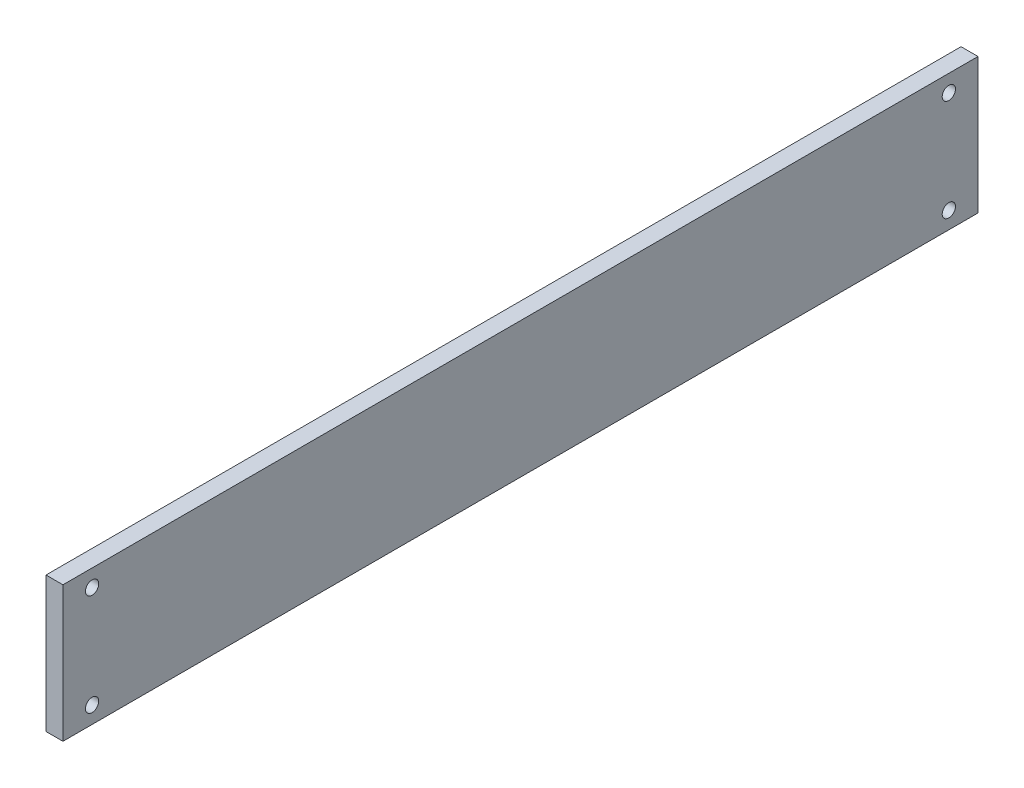
ISO-10303-21;
HEADER;
FILE_DESCRIPTION(('STEP AP214'),'2;1');
FILE_NAME('part.step','',(''),(''),'','','');
FILE_SCHEMA(('AUTOMOTIVE_DESIGN { 1 0 10303 214 1 1 1 1 }'));
ENDSEC;
DATA;
#1=APPLICATION_CONTEXT('core data for automotive mechanical design processes');
#2=APPLICATION_PROTOCOL_DEFINITION('international standard','automotive_design',2000,#1);
#3=PRODUCT_CONTEXT('',#1,'mechanical');
#4=PRODUCT('Part','Part','',(#3));
#5=PRODUCT_RELATED_PRODUCT_CATEGORY('part','',(#4));
#6=PRODUCT_DEFINITION_FORMATION('','',#4);
#7=PRODUCT_DEFINITION_CONTEXT('part definition',#1,'design');
#8=PRODUCT_DEFINITION('design','',#6,#7);
#9=PRODUCT_DEFINITION_SHAPE('','',#8);
#10=(LENGTH_UNIT() NAMED_UNIT(*) SI_UNIT(.MILLI.,.METRE.));
#11=(NAMED_UNIT(*) PLANE_ANGLE_UNIT() SI_UNIT($,.RADIAN.));
#12=(NAMED_UNIT(*) SI_UNIT($,.STERADIAN.) SOLID_ANGLE_UNIT());
#13=UNCERTAINTY_MEASURE_WITH_UNIT(LENGTH_MEASURE(1.E-05),#10,'distance_accuracy_value','');
#14=(GEOMETRIC_REPRESENTATION_CONTEXT(3) GLOBAL_UNCERTAINTY_ASSIGNED_CONTEXT((#13)) GLOBAL_UNIT_ASSIGNED_CONTEXT((#10,
#11,#12)) REPRESENTATION_CONTEXT('',''));
#15=CARTESIAN_POINT('',(0.,0.,0.));
#16=DIRECTION('',(0.,0.,1.));
#17=DIRECTION('',(1.,0.,0.));
#18=AXIS2_PLACEMENT_3D('',#15,#16,#17);
#19=CARTESIAN_POINT('',(6.35,0.,0.));
#20=DIRECTION('',(1.,0.,0.));
#21=DIRECTION('',(0.,0.,-1.));
#22=AXIS2_PLACEMENT_3D('',#19,#20,#21);
#23=PLANE('',#22);
#24=CARTESIAN_POINT('',(6.35,-19.05,-160.528));
#25=DIRECTION('',(1.,0.,0.));
#26=DIRECTION('',(0.,0.,-1.));
#27=AXIS2_PLACEMENT_3D('',#24,#25,#26);
#28=CIRCLE('',#27,2.4892);
#29=CARTESIAN_POINT('',(6.35,-19.05,-163.0172));
#30=VERTEX_POINT('',#29);
#31=EDGE_CURVE('E146',#30,#30,#28,.T.);
#32=ORIENTED_EDGE('',*,*,#31,.F.);
#33=EDGE_LOOP('',(#32));
#34=FACE_BOUND('',#33,.T.);
#35=CARTESIAN_POINT('',(6.35,19.05,160.528));
#36=DIRECTION('',(1.,0.,0.));
#37=DIRECTION('',(0.,0.,-1.));
#38=AXIS2_PLACEMENT_3D('',#35,#36,#37);
#39=CIRCLE('',#38,2.4892);
#40=CARTESIAN_POINT('',(6.35,19.05,158.0388));
#41=VERTEX_POINT('',#40);
#42=EDGE_CURVE('E116',#41,#41,#39,.T.);
#43=ORIENTED_EDGE('',*,*,#42,.F.);
#44=EDGE_LOOP('',(#43));
#45=FACE_BOUND('',#44,.T.);
#46=DIRECTION('',(0.,1.,0.));
#47=VECTOR('',#46,1.);
#48=CARTESIAN_POINT('',(6.35,25.4,-171.45));
#49=LINE('',#48,#47);
#50=CARTESIAN_POINT('',(6.35,-25.4,-171.45));
#51=VERTEX_POINT('',#50);
#52=CARTESIAN_POINT('',(6.35,25.4,-171.45));
#53=VERTEX_POINT('',#52);
#54=EDGE_CURVE('E96',#51,#53,#49,.T.);
#55=ORIENTED_EDGE('',*,*,#54,.T.);
#56=DIRECTION('',(0.,0.,1.));
#57=VECTOR('',#56,1.);
#58=CARTESIAN_POINT('',(6.35,25.4,171.45));
#59=LINE('',#58,#57);
#60=CARTESIAN_POINT('',(6.35,25.4,171.45));
#61=VERTEX_POINT('',#60);
#62=EDGE_CURVE('E91',#53,#61,#59,.T.);
#63=ORIENTED_EDGE('',*,*,#62,.T.);
#64=DIRECTION('',(0.,-1.,0.));
#65=VECTOR('',#64,1.);
#66=CARTESIAN_POINT('',(6.35,25.4,171.45));
#67=LINE('',#66,#65);
#68=CARTESIAN_POINT('',(6.35,-25.4,171.45));
#69=VERTEX_POINT('',#68);
#70=EDGE_CURVE('E94',#61,#69,#67,.T.);
#71=ORIENTED_EDGE('',*,*,#70,.T.);
#72=DIRECTION('',(0.,0.,-1.));
#73=VECTOR('',#72,1.);
#74=CARTESIAN_POINT('',(6.35,-25.4,171.45));
#75=LINE('',#74,#73);
#76=EDGE_CURVE('E61',#69,#51,#75,.T.);
#77=ORIENTED_EDGE('',*,*,#76,.T.);
#78=EDGE_LOOP('',(#55,#63,#71,#77));
#79=FACE_BOUND('',#78,.T.);
#80=CARTESIAN_POINT('',(6.35,-19.05,160.528));
#81=DIRECTION('',(1.,0.,0.));
#82=DIRECTION('',(0.,0.,-1.));
#83=AXIS2_PLACEMENT_3D('',#80,#81,#82);
#84=CIRCLE('',#83,2.4892);
#85=CARTESIAN_POINT('',(6.35,-19.05,158.0388));
#86=VERTEX_POINT('',#85);
#87=EDGE_CURVE('E138',#86,#86,#84,.T.);
#88=ORIENTED_EDGE('',*,*,#87,.F.);
#89=EDGE_LOOP('',(#88));
#90=FACE_BOUND('',#89,.T.);
#91=CARTESIAN_POINT('',(6.35,19.05,-160.528));
#92=DIRECTION('',(1.,0.,0.));
#93=DIRECTION('',(0.,0.,-1.));
#94=AXIS2_PLACEMENT_3D('',#91,#92,#93);
#95=CIRCLE('',#94,2.4892);
#96=CARTESIAN_POINT('',(6.35,19.05,-163.0172));
#97=VERTEX_POINT('',#96);
#98=EDGE_CURVE('E154',#97,#97,#95,.T.);
#99=ORIENTED_EDGE('',*,*,#98,.F.);
#100=EDGE_LOOP('',(#99));
#101=FACE_BOUND('',#100,.T.);
#102=ADVANCED_FACE('F43',(#34,#45,#79,#90,#101),#23,.T.);
#103=CARTESIAN_POINT('',(0.,0.,0.));
#104=DIRECTION('',(1.,0.,0.));
#105=DIRECTION('',(0.,0.,-1.));
#106=AXIS2_PLACEMENT_3D('',#103,#104,#105);
#107=PLANE('',#106);
#108=DIRECTION('',(0.,1.,0.));
#109=VECTOR('',#108,1.);
#110=CARTESIAN_POINT('',(0.,25.4,-171.45));
#111=LINE('',#110,#109);
#112=CARTESIAN_POINT('',(0.,-25.4,-171.45));
#113=VERTEX_POINT('',#112);
#114=CARTESIAN_POINT('',(0.,25.4,-171.45));
#115=VERTEX_POINT('',#114);
#116=EDGE_CURVE('E112',#113,#115,#111,.T.);
#117=ORIENTED_EDGE('',*,*,#116,.F.);
#118=DIRECTION('',(0.,0.,-1.));
#119=VECTOR('',#118,1.);
#120=CARTESIAN_POINT('',(0.,-25.4,171.45));
#121=LINE('',#120,#119);
#122=CARTESIAN_POINT('',(0.,-25.4,171.45));
#123=VERTEX_POINT('',#122);
#124=EDGE_CURVE('E84',#123,#113,#121,.T.);
#125=ORIENTED_EDGE('',*,*,#124,.F.);
#126=DIRECTION('',(0.,-1.,0.));
#127=VECTOR('',#126,1.);
#128=CARTESIAN_POINT('',(0.,25.4,171.45));
#129=LINE('',#128,#127);
#130=CARTESIAN_POINT('',(0.,25.4,171.45));
#131=VERTEX_POINT('',#130);
#132=EDGE_CURVE('E78',#131,#123,#129,.T.);
#133=ORIENTED_EDGE('',*,*,#132,.F.);
#134=DIRECTION('',(0.,0.,1.));
#135=VECTOR('',#134,1.);
#136=CARTESIAN_POINT('',(0.,25.4,171.45));
#137=LINE('',#136,#135);
#138=EDGE_CURVE('E101',#115,#131,#137,.T.);
#139=ORIENTED_EDGE('',*,*,#138,.F.);
#140=EDGE_LOOP('',(#117,#125,#133,#139));
#141=FACE_BOUND('',#140,.T.);
#142=CARTESIAN_POINT('',(0.,19.05,160.528));
#143=DIRECTION('',(1.,0.,0.));
#144=DIRECTION('',(0.,0.,-1.));
#145=AXIS2_PLACEMENT_3D('',#142,#143,#144);
#146=CIRCLE('',#145,2.4892);
#147=CARTESIAN_POINT('',(0.,19.05,158.0388));
#148=VERTEX_POINT('',#147);
#149=EDGE_CURVE('E134',#148,#148,#146,.T.);
#150=ORIENTED_EDGE('',*,*,#149,.T.);
#151=EDGE_LOOP('',(#150));
#152=FACE_BOUND('',#151,.T.);
#153=CARTESIAN_POINT('',(0.,-19.05,160.528));
#154=DIRECTION('',(1.,0.,0.));
#155=DIRECTION('',(0.,0.,-1.));
#156=AXIS2_PLACEMENT_3D('',#153,#154,#155);
#157=CIRCLE('',#156,2.4892);
#158=CARTESIAN_POINT('',(0.,-19.05,158.0388));
#159=VERTEX_POINT('',#158);
#160=EDGE_CURVE('E142',#159,#159,#157,.T.);
#161=ORIENTED_EDGE('',*,*,#160,.T.);
#162=EDGE_LOOP('',(#161));
#163=FACE_BOUND('',#162,.T.);
#164=CARTESIAN_POINT('',(0.,-19.05,-160.528));
#165=DIRECTION('',(1.,0.,0.));
#166=DIRECTION('',(0.,0.,-1.));
#167=AXIS2_PLACEMENT_3D('',#164,#165,#166);
#168=CIRCLE('',#167,2.4892);
#169=CARTESIAN_POINT('',(0.,-19.05,-163.0172));
#170=VERTEX_POINT('',#169);
#171=EDGE_CURVE('E150',#170,#170,#168,.T.);
#172=ORIENTED_EDGE('',*,*,#171,.T.);
#173=EDGE_LOOP('',(#172));
#174=FACE_BOUND('',#173,.T.);
#175=CARTESIAN_POINT('',(0.,19.05,-160.528));
#176=DIRECTION('',(1.,0.,0.));
#177=DIRECTION('',(0.,0.,-1.));
#178=AXIS2_PLACEMENT_3D('',#175,#176,#177);
#179=CIRCLE('',#178,2.4892);
#180=CARTESIAN_POINT('',(0.,19.05,-163.0172));
#181=VERTEX_POINT('',#180);
#182=EDGE_CURVE('E158',#181,#181,#179,.T.);
#183=ORIENTED_EDGE('',*,*,#182,.T.);
#184=EDGE_LOOP('',(#183));
#185=FACE_BOUND('',#184,.T.);
#186=ADVANCED_FACE('F129',(#141,#152,#163,#174,#185),#107,.F.);
#187=CARTESIAN_POINT('',(6.35,25.4,-171.45));
#188=DIRECTION('',(0.,0.,1.));
#189=DIRECTION('',(1.,0.,0.));
#190=AXIS2_PLACEMENT_3D('',#187,#188,#189);
#191=PLANE('',#190);
#192=ORIENTED_EDGE('',*,*,#116,.T.);
#193=DIRECTION('',(-1.,0.,0.));
#194=VECTOR('',#193,1.);
#195=CARTESIAN_POINT('',(6.35,25.4,-171.45));
#196=LINE('',#195,#194);
#197=EDGE_CURVE('E11',#53,#115,#196,.T.);
#198=ORIENTED_EDGE('',*,*,#197,.F.);
#199=ORIENTED_EDGE('',*,*,#54,.F.);
#200=DIRECTION('',(-1.,0.,0.));
#201=VECTOR('',#200,1.);
#202=CARTESIAN_POINT('',(6.35,-25.4,-171.45));
#203=LINE('',#202,#201);
#204=EDGE_CURVE('E108',#51,#113,#203,.T.);
#205=ORIENTED_EDGE('',*,*,#204,.T.);
#206=EDGE_LOOP('',(#192,#198,#199,#205));
#207=FACE_BOUND('',#206,.T.);
#208=ADVANCED_FACE('F45',(#207),#191,.F.);
#209=CARTESIAN_POINT('',(6.35,25.4,171.45));
#210=DIRECTION('',(0.,-1.,0.));
#211=DIRECTION('',(0.,0.,-1.));
#212=AXIS2_PLACEMENT_3D('',#209,#210,#211);
#213=PLANE('',#212);
#214=ORIENTED_EDGE('',*,*,#138,.T.);
#215=DIRECTION('',(-1.,0.,0.));
#216=VECTOR('',#215,1.);
#217=CARTESIAN_POINT('',(6.35,25.4,171.45));
#218=LINE('',#217,#216);
#219=EDGE_CURVE('E53',#61,#131,#218,.T.);
#220=ORIENTED_EDGE('',*,*,#219,.F.);
#221=ORIENTED_EDGE('',*,*,#62,.F.);
#222=ORIENTED_EDGE('',*,*,#197,.T.);
#223=EDGE_LOOP('',(#214,#220,#221,#222));
#224=FACE_BOUND('',#223,.T.);
#225=ADVANCED_FACE('F100',(#224),#213,.F.);
#226=CARTESIAN_POINT('',(6.35,25.4,171.45));
#227=DIRECTION('',(0.,0.,-1.));
#228=DIRECTION('',(-1.,0.,0.));
#229=AXIS2_PLACEMENT_3D('',#226,#227,#228);
#230=PLANE('',#229);
#231=ORIENTED_EDGE('',*,*,#132,.T.);
#232=DIRECTION('',(-1.,0.,0.));
#233=VECTOR('',#232,1.);
#234=CARTESIAN_POINT('',(6.35,-25.4,171.45));
#235=LINE('',#234,#233);
#236=EDGE_CURVE('E103',#69,#123,#235,.T.);
#237=ORIENTED_EDGE('',*,*,#236,.F.);
#238=ORIENTED_EDGE('',*,*,#70,.F.);
#239=ORIENTED_EDGE('',*,*,#219,.T.);
#240=EDGE_LOOP('',(#231,#237,#238,#239));
#241=FACE_BOUND('',#240,.T.);
#242=ADVANCED_FACE('F104',(#241),#230,.F.);
#243=CARTESIAN_POINT('',(6.35,-25.4,171.45));
#244=DIRECTION('',(0.,1.,0.));
#245=DIRECTION('',(0.,0.,1.));
#246=AXIS2_PLACEMENT_3D('',#243,#244,#245);
#247=PLANE('',#246);
#248=ORIENTED_EDGE('',*,*,#124,.T.);
#249=ORIENTED_EDGE('',*,*,#204,.F.);
#250=ORIENTED_EDGE('',*,*,#76,.F.);
#251=ORIENTED_EDGE('',*,*,#236,.T.);
#252=EDGE_LOOP('',(#248,#249,#250,#251));
#253=FACE_BOUND('',#252,.T.);
#254=ADVANCED_FACE('F126',(#253),#247,.F.);
#255=CARTESIAN_POINT('',(6.35,19.05,160.528));
#256=DIRECTION('',(-1.,0.,0.));
#257=DIRECTION('',(0.,0.,1.));
#258=AXIS2_PLACEMENT_3D('',#255,#256,#257);
#259=CYLINDRICAL_SURFACE('',#258,2.4892);
#260=ORIENTED_EDGE('',*,*,#42,.T.);
#261=EDGE_LOOP('',(#260));
#262=FACE_BOUND('',#261,.T.);
#263=ORIENTED_EDGE('',*,*,#149,.F.);
#264=EDGE_LOOP('',(#263));
#265=FACE_BOUND('',#264,.T.);
#266=ADVANCED_FACE('F179',(#262,#265),#259,.F.);
#267=CARTESIAN_POINT('',(6.35,-19.05,160.528));
#268=DIRECTION('',(-1.,0.,0.));
#269=DIRECTION('',(0.,0.,1.));
#270=AXIS2_PLACEMENT_3D('',#267,#268,#269);
#271=CYLINDRICAL_SURFACE('',#270,2.4892);
#272=ORIENTED_EDGE('',*,*,#87,.T.);
#273=EDGE_LOOP('',(#272));
#274=FACE_BOUND('',#273,.T.);
#275=ORIENTED_EDGE('',*,*,#160,.F.);
#276=EDGE_LOOP('',(#275));
#277=FACE_BOUND('',#276,.T.);
#278=ADVANCED_FACE('F233',(#274,#277),#271,.F.);
#279=CARTESIAN_POINT('',(6.35,-19.05,-160.528));
#280=DIRECTION('',(-1.,0.,0.));
#281=DIRECTION('',(0.,0.,1.));
#282=AXIS2_PLACEMENT_3D('',#279,#280,#281);
#283=CYLINDRICAL_SURFACE('',#282,2.4892);
#284=ORIENTED_EDGE('',*,*,#31,.T.);
#285=EDGE_LOOP('',(#284));
#286=FACE_BOUND('',#285,.T.);
#287=ORIENTED_EDGE('',*,*,#171,.F.);
#288=EDGE_LOOP('',(#287));
#289=FACE_BOUND('',#288,.T.);
#290=ADVANCED_FACE('F242',(#286,#289),#283,.F.);
#291=CARTESIAN_POINT('',(6.35,19.05,-160.528));
#292=DIRECTION('',(-1.,0.,0.));
#293=DIRECTION('',(0.,0.,1.));
#294=AXIS2_PLACEMENT_3D('',#291,#292,#293);
#295=CYLINDRICAL_SURFACE('',#294,2.4892);
#296=ORIENTED_EDGE('',*,*,#98,.T.);
#297=EDGE_LOOP('',(#296));
#298=FACE_BOUND('',#297,.T.);
#299=ORIENTED_EDGE('',*,*,#182,.F.);
#300=EDGE_LOOP('',(#299));
#301=FACE_BOUND('',#300,.T.);
#302=ADVANCED_FACE('F166',(#298,#301),#295,.F.);
#303=CLOSED_SHELL('',(#102,#186,#208,#225,#242,#254,#266,#278,#290,#302));
#304=MANIFOLD_SOLID_BREP('B2',#303);
#305=ADVANCED_BREP_SHAPE_REPRESENTATION('',(#18,#304),#14);
#306=SHAPE_DEFINITION_REPRESENTATION(#9,#305);
ENDSEC;
END-ISO-10303-21;
